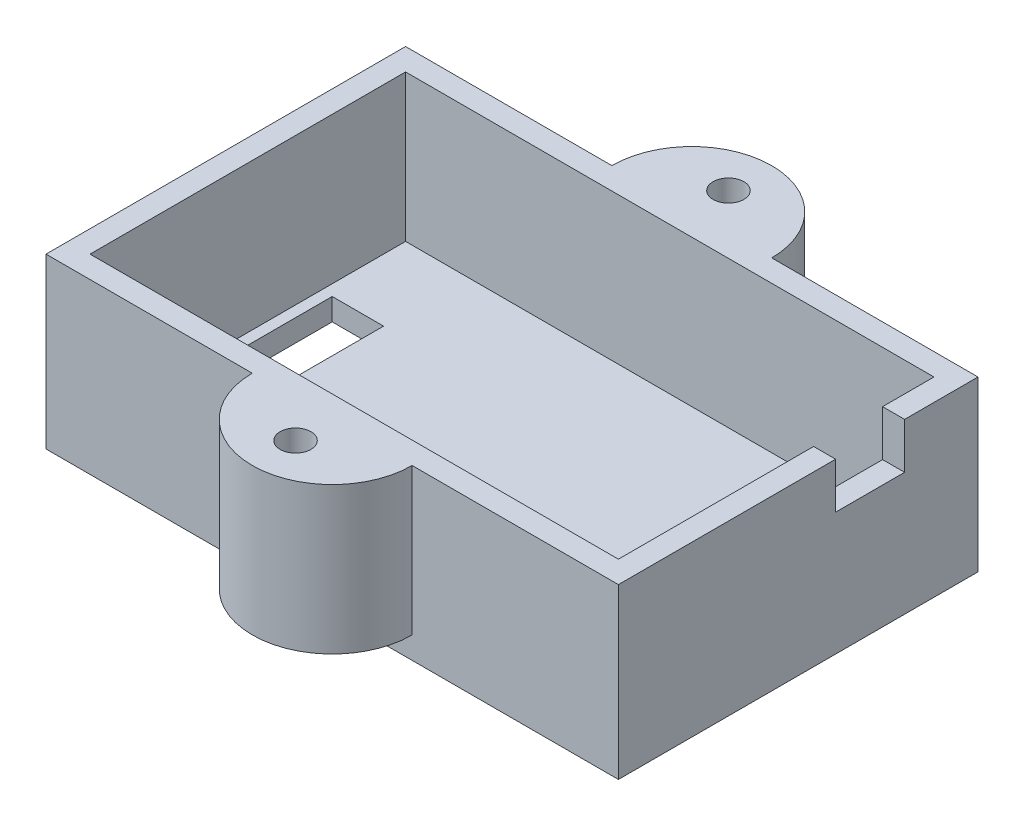
ISO-10303-21;
HEADER;
FILE_DESCRIPTION(('STEP AP214'),'2;1');
FILE_NAME('part.step','',(''),(''),'','','');
FILE_SCHEMA(('AUTOMOTIVE_DESIGN { 1 0 10303 214 1 1 1 1 }'));
ENDSEC;
DATA;
#1=APPLICATION_CONTEXT('core data for automotive mechanical design processes');
#2=APPLICATION_PROTOCOL_DEFINITION('international standard','automotive_design',2000,#1);
#3=PRODUCT_CONTEXT('',#1,'mechanical');
#4=PRODUCT('Part','Part','',(#3));
#5=PRODUCT_RELATED_PRODUCT_CATEGORY('part','',(#4));
#6=PRODUCT_DEFINITION_FORMATION('','',#4);
#7=PRODUCT_DEFINITION_CONTEXT('part definition',#1,'design');
#8=PRODUCT_DEFINITION('design','',#6,#7);
#9=PRODUCT_DEFINITION_SHAPE('','',#8);
#10=(LENGTH_UNIT() NAMED_UNIT(*) SI_UNIT(.MILLI.,.METRE.));
#11=(NAMED_UNIT(*) PLANE_ANGLE_UNIT() SI_UNIT($,.RADIAN.));
#12=(NAMED_UNIT(*) SI_UNIT($,.STERADIAN.) SOLID_ANGLE_UNIT());
#13=UNCERTAINTY_MEASURE_WITH_UNIT(LENGTH_MEASURE(1.E-05),#10,'distance_accuracy_value','');
#14=(GEOMETRIC_REPRESENTATION_CONTEXT(3) GLOBAL_UNCERTAINTY_ASSIGNED_CONTEXT((#13)) GLOBAL_UNIT_ASSIGNED_CONTEXT((#10,
#11,#12)) REPRESENTATION_CONTEXT('',''));
#15=CARTESIAN_POINT('',(0.,0.,0.));
#16=DIRECTION('',(0.,0.,1.));
#17=DIRECTION('',(1.,0.,0.));
#18=AXIS2_PLACEMENT_3D('',#15,#16,#17);
#19=CARTESIAN_POINT('',(0.,0.,-24.5));
#20=DIRECTION('',(0.,1.,0.));
#21=DIRECTION('',(0.,0.,1.));
#22=AXIS2_PLACEMENT_3D('',#19,#20,#21);
#23=PLANE('',#22);
#24=CARTESIAN_POINT('',(0.,0.,-29.5));
#25=DIRECTION('',(0.,1.,0.));
#26=DIRECTION('',(0.,0.,1.));
#27=AXIS2_PLACEMENT_3D('',#24,#25,#26);
#28=CIRCLE('',#27,2.1);
#29=CARTESIAN_POINT('',(0.,0.,-27.4));
#30=VERTEX_POINT('',#29);
#31=EDGE_CURVE('E282',#30,#30,#28,.T.);
#32=ORIENTED_EDGE('',*,*,#31,.T.);
#33=EDGE_LOOP('',(#32));
#34=FACE_BOUND('',#33,.T.);
#35=DIRECTION('',(1.,0.,0.));
#36=VECTOR('',#35,1.);
#37=CARTESIAN_POINT('',(39.,0.,-24.5));
#38=LINE('',#37,#36);
#39=CARTESIAN_POINT('',(-10.89,0.,-24.5));
#40=VERTEX_POINT('',#39);
#41=CARTESIAN_POINT('',(10.89,0.,-24.5));
#42=VERTEX_POINT('',#41);
#43=EDGE_CURVE('E274',#40,#42,#38,.T.);
#44=ORIENTED_EDGE('',*,*,#43,.F.);
#45=CARTESIAN_POINT('',(0.,0.,-24.5));
#46=DIRECTION('',(0.,1.,0.));
#47=DIRECTION('',(0.,0.,1.));
#48=AXIS2_PLACEMENT_3D('',#45,#46,#47);
#49=CIRCLE('',#48,10.89);
#50=EDGE_CURVE('E342',#42,#40,#49,.T.);
#51=ORIENTED_EDGE('',*,*,#50,.F.);
#52=EDGE_LOOP('',(#44,#51));
#53=FACE_BOUND('',#52,.T.);
#54=ADVANCED_FACE('F38',(#34,#53),#23,.F.);
#55=CARTESIAN_POINT('',(0.,0.,29.5));
#56=DIRECTION('',(0.,1.,0.));
#57=DIRECTION('',(0.,0.,1.));
#58=AXIS2_PLACEMENT_3D('',#55,#56,#57);
#59=CIRCLE('',#58,2.1);
#60=CARTESIAN_POINT('',(0.,0.,31.6));
#61=VERTEX_POINT('',#60);
#62=EDGE_CURVE('E270',#61,#61,#59,.T.);
#63=ORIENTED_EDGE('',*,*,#62,.T.);
#64=EDGE_LOOP('',(#63));
#65=FACE_BOUND('',#64,.T.);
#66=DIRECTION('',(-1.,0.,0.));
#67=VECTOR('',#66,1.);
#68=CARTESIAN_POINT('',(39.,0.,24.5));
#69=LINE('',#68,#67);
#70=CARTESIAN_POINT('',(10.89,0.,24.5));
#71=VERTEX_POINT('',#70);
#72=CARTESIAN_POINT('',(-10.89,0.,24.5));
#73=VERTEX_POINT('',#72);
#74=EDGE_CURVE('E271',#71,#73,#69,.T.);
#75=ORIENTED_EDGE('',*,*,#74,.F.);
#76=CARTESIAN_POINT('',(0.,0.,24.5));
#77=DIRECTION('',(0.,1.,0.));
#78=DIRECTION('',(0.,0.,-1.));
#79=AXIS2_PLACEMENT_3D('',#76,#77,#78);
#80=CIRCLE('',#79,10.89);
#81=EDGE_CURVE('E336',#73,#71,#80,.T.);
#82=ORIENTED_EDGE('',*,*,#81,.F.);
#83=EDGE_LOOP('',(#75,#82));
#84=FACE_BOUND('',#83,.T.);
#85=ADVANCED_FACE('F457',(#65,#84),#23,.F.);
#86=CARTESIAN_POINT('',(0.,20.,-24.5));
#87=DIRECTION('',(0.,1.,0.));
#88=DIRECTION('',(0.,0.,1.));
#89=AXIS2_PLACEMENT_3D('',#86,#87,#88);
#90=PLANE('',#89);
#91=DIRECTION('',(1.,0.,0.));
#92=VECTOR('',#91,1.);
#93=CARTESIAN_POINT('',(29.,20.,-5.09999999999999));
#94=LINE('',#93,#92);
#95=CARTESIAN_POINT('',(36.,20.,-5.09999999999999));
#96=VERTEX_POINT('',#95);
#97=CARTESIAN_POINT('',(39.,20.,-5.1));
#98=VERTEX_POINT('',#97);
#99=EDGE_CURVE('E190',#96,#98,#94,.T.);
#100=ORIENTED_EDGE('',*,*,#99,.F.);
#101=DIRECTION('',(0.,0.,-1.));
#102=VECTOR('',#101,1.);
#103=CARTESIAN_POINT('',(36.,20.,-21.5));
#104=LINE('',#103,#102);
#105=CARTESIAN_POINT('',(36.,20.,21.5));
#106=VERTEX_POINT('',#105);
#107=EDGE_CURVE('E294',#106,#96,#104,.T.);
#108=ORIENTED_EDGE('',*,*,#107,.F.);
#109=DIRECTION('',(1.,0.,0.));
#110=VECTOR('',#109,1.);
#111=CARTESIAN_POINT('',(-36.,20.,21.5));
#112=LINE('',#111,#110);
#113=CARTESIAN_POINT('',(-36.,20.,21.5));
#114=VERTEX_POINT('',#113);
#115=EDGE_CURVE('E306',#114,#106,#112,.T.);
#116=ORIENTED_EDGE('',*,*,#115,.F.);
#117=DIRECTION('',(0.,0.,1.));
#118=VECTOR('',#117,1.);
#119=CARTESIAN_POINT('',(-36.,20.,-21.5));
#120=LINE('',#119,#118);
#121=CARTESIAN_POINT('',(-36.,20.,-21.5));
#122=VERTEX_POINT('',#121);
#123=EDGE_CURVE('E302',#122,#114,#120,.T.);
#124=ORIENTED_EDGE('',*,*,#123,.F.);
#125=DIRECTION('',(-1.,0.,0.));
#126=VECTOR('',#125,1.);
#127=CARTESIAN_POINT('',(-36.,20.,-21.5));
#128=LINE('',#127,#126);
#129=CARTESIAN_POINT('',(36.,20.,-21.5));
#130=VERTEX_POINT('',#129);
#131=EDGE_CURVE('E298',#130,#122,#128,.T.);
#132=ORIENTED_EDGE('',*,*,#131,.F.);
#133=CARTESIAN_POINT('',(36.,20.,-14.5));
#134=VERTEX_POINT('',#133);
#135=EDGE_CURVE('E299',#134,#130,#104,.T.);
#136=ORIENTED_EDGE('',*,*,#135,.F.);
#137=DIRECTION('',(1.,0.,0.));
#138=VECTOR('',#137,1.);
#139=CARTESIAN_POINT('',(29.,20.,-14.5));
#140=LINE('',#139,#138);
#141=CARTESIAN_POINT('',(39.,20.,-14.5));
#142=VERTEX_POINT('',#141);
#143=EDGE_CURVE('E208',#134,#142,#140,.T.);
#144=ORIENTED_EDGE('',*,*,#143,.T.);
#145=DIRECTION('',(0.,0.,-1.));
#146=VECTOR('',#145,1.);
#147=CARTESIAN_POINT('',(39.,20.,10.8860619305484));
#148=LINE('',#147,#146);
#149=CARTESIAN_POINT('',(39.,20.,-24.5));
#150=VERTEX_POINT('',#149);
#151=EDGE_CURVE('E354',#142,#150,#148,.T.);
#152=ORIENTED_EDGE('',*,*,#151,.T.);
#153=DIRECTION('',(-1.,0.,0.));
#154=VECTOR('',#153,1.);
#155=CARTESIAN_POINT('',(10.89,20.,-24.5));
#156=LINE('',#155,#154);
#157=CARTESIAN_POINT('',(10.89,20.,-24.5));
#158=VERTEX_POINT('',#157);
#159=EDGE_CURVE('E358',#150,#158,#156,.T.);
#160=ORIENTED_EDGE('',*,*,#159,.T.);
#161=CARTESIAN_POINT('',(0.,20.,-24.5));
#162=DIRECTION('',(0.,1.,0.));
#163=DIRECTION('',(0.,0.,1.));
#164=AXIS2_PLACEMENT_3D('',#161,#162,#163);
#165=CIRCLE('',#164,10.89);
#166=CARTESIAN_POINT('',(-10.89,20.,-24.5));
#167=VERTEX_POINT('',#166);
#168=EDGE_CURVE('E361',#158,#167,#165,.T.);
#169=ORIENTED_EDGE('',*,*,#168,.T.);
#170=DIRECTION('',(-1.,0.,0.));
#171=VECTOR('',#170,1.);
#172=CARTESIAN_POINT('',(-39.,20.,-24.5));
#173=LINE('',#172,#171);
#174=CARTESIAN_POINT('',(-39.,20.,-24.5));
#175=VERTEX_POINT('',#174);
#176=EDGE_CURVE('E337',#167,#175,#173,.T.);
#177=ORIENTED_EDGE('',*,*,#176,.T.);
#178=DIRECTION('',(0.,0.,1.));
#179=VECTOR('',#178,1.);
#180=CARTESIAN_POINT('',(-39.,20.,-24.5));
#181=LINE('',#180,#179);
#182=CARTESIAN_POINT('',(-39.,20.,24.5));
#183=VERTEX_POINT('',#182);
#184=EDGE_CURVE('E341',#175,#183,#181,.T.);
#185=ORIENTED_EDGE('',*,*,#184,.T.);
#186=DIRECTION('',(1.,0.,0.));
#187=VECTOR('',#186,1.);
#188=CARTESIAN_POINT('',(-39.,20.,24.5));
#189=LINE('',#188,#187);
#190=CARTESIAN_POINT('',(-10.89,20.,24.5));
#191=VERTEX_POINT('',#190);
#192=EDGE_CURVE('E345',#183,#191,#189,.T.);
#193=ORIENTED_EDGE('',*,*,#192,.T.);
#194=CARTESIAN_POINT('',(0.,20.,24.5));
#195=DIRECTION('',(0.,1.,0.));
#196=DIRECTION('',(0.,0.,-1.));
#197=AXIS2_PLACEMENT_3D('',#194,#195,#196);
#198=CIRCLE('',#197,10.89);
#199=CARTESIAN_POINT('',(10.89,20.,24.5));
#200=VERTEX_POINT('',#199);
#201=EDGE_CURVE('E348',#191,#200,#198,.T.);
#202=ORIENTED_EDGE('',*,*,#201,.T.);
#203=DIRECTION('',(1.,0.,0.));
#204=VECTOR('',#203,1.);
#205=CARTESIAN_POINT('',(10.89,20.,24.5));
#206=LINE('',#205,#204);
#207=CARTESIAN_POINT('',(39.,20.,24.5));
#208=VERTEX_POINT('',#207);
#209=EDGE_CURVE('E351',#200,#208,#206,.T.);
#210=ORIENTED_EDGE('',*,*,#209,.T.);
#211=EDGE_CURVE('E355',#208,#98,#148,.T.);
#212=ORIENTED_EDGE('',*,*,#211,.T.);
#213=EDGE_LOOP('',(#100,#108,#116,#124,#132,#136,#144,#152,#160,#169,#177,#185,#193,#202,#210,#212));
#214=FACE_BOUND('',#213,.T.);
#215=CARTESIAN_POINT('',(0.,20.,-29.5));
#216=DIRECTION('',(0.,1.,0.));
#217=DIRECTION('',(0.,0.,1.));
#218=AXIS2_PLACEMENT_3D('',#215,#216,#217);
#219=CIRCLE('',#218,2.1);
#220=CARTESIAN_POINT('',(0.,20.,-27.4));
#221=VERTEX_POINT('',#220);
#222=EDGE_CURVE('E286',#221,#221,#219,.T.);
#223=ORIENTED_EDGE('',*,*,#222,.F.);
#224=EDGE_LOOP('',(#223));
#225=FACE_BOUND('',#224,.T.);
#226=CARTESIAN_POINT('',(0.,20.,29.5));
#227=DIRECTION('',(0.,1.,0.));
#228=DIRECTION('',(0.,0.,1.));
#229=AXIS2_PLACEMENT_3D('',#226,#227,#228);
#230=CIRCLE('',#229,2.1);
#231=CARTESIAN_POINT('',(0.,20.,31.6));
#232=VERTEX_POINT('',#231);
#233=EDGE_CURVE('E278',#232,#232,#230,.T.);
#234=ORIENTED_EDGE('',*,*,#233,.F.);
#235=EDGE_LOOP('',(#234));
#236=FACE_BOUND('',#235,.T.);
#237=ADVANCED_FACE('F408',(#214,#225,#236),#90,.T.);
#238=CARTESIAN_POINT('',(-39.,20.,10.8860619305484));
#239=DIRECTION('',(1.,0.,0.));
#240=DIRECTION('',(0.,0.,-1.));
#241=AXIS2_PLACEMENT_3D('',#238,#239,#240);
#242=PLANE('',#241);
#243=DIRECTION('',(0.,-1.,0.));
#244=VECTOR('',#243,1.);
#245=CARTESIAN_POINT('',(-39.,20.,-24.5));
#246=LINE('',#245,#244);
#247=CARTESIAN_POINT('',(-39.,-3.,-24.5));
#248=VERTEX_POINT('',#247);
#249=EDGE_CURVE('E275',#175,#248,#246,.T.);
#250=ORIENTED_EDGE('',*,*,#249,.T.);
#251=DIRECTION('',(0.,0.,-1.));
#252=VECTOR('',#251,1.);
#253=CARTESIAN_POINT('',(-39.,-3.,24.5));
#254=LINE('',#253,#252);
#255=CARTESIAN_POINT('',(-39.,-3.,24.5));
#256=VERTEX_POINT('',#255);
#257=EDGE_CURVE('E262',#256,#248,#254,.T.);
#258=ORIENTED_EDGE('',*,*,#257,.F.);
#259=DIRECTION('',(0.,-1.,0.));
#260=VECTOR('',#259,1.);
#261=CARTESIAN_POINT('',(-39.,20.,24.5));
#262=LINE('',#261,#260);
#263=EDGE_CURVE('E392',#183,#256,#262,.T.);
#264=ORIENTED_EDGE('',*,*,#263,.F.);
#265=ORIENTED_EDGE('',*,*,#184,.F.);
#266=EDGE_LOOP('',(#250,#258,#264,#265));
#267=FACE_BOUND('',#266,.T.);
#268=ADVANCED_FACE('F40',(#267),#242,.F.);
#269=CARTESIAN_POINT('',(0.,20.,24.5));
#270=DIRECTION('',(0.,-1.,0.));
#271=DIRECTION('',(0.,0.,-1.));
#272=AXIS2_PLACEMENT_3D('',#269,#270,#271);
#273=CYLINDRICAL_SURFACE('',#272,10.89);
#274=ORIENTED_EDGE('',*,*,#81,.T.);
#275=DIRECTION('',(0.,-1.,0.));
#276=VECTOR('',#275,1.);
#277=CARTESIAN_POINT('',(10.89,20.,24.5));
#278=LINE('',#277,#276);
#279=EDGE_CURVE('E384',#200,#71,#278,.T.);
#280=ORIENTED_EDGE('',*,*,#279,.F.);
#281=ORIENTED_EDGE('',*,*,#201,.F.);
#282=DIRECTION('',(0.,-1.,0.));
#283=VECTOR('',#282,1.);
#284=CARTESIAN_POINT('',(-10.89,20.,24.5));
#285=LINE('',#284,#283);
#286=EDGE_CURVE('E388',#191,#73,#285,.T.);
#287=ORIENTED_EDGE('',*,*,#286,.T.);
#288=EDGE_LOOP('',(#274,#280,#281,#287));
#289=FACE_BOUND('',#288,.T.);
#290=ADVANCED_FACE('F477',(#289),#273,.T.);
#291=CARTESIAN_POINT('',(10.89,20.,24.5));
#292=DIRECTION('',(0.,0.,-1.));
#293=DIRECTION('',(-1.,0.,0.));
#294=AXIS2_PLACEMENT_3D('',#291,#292,#293);
#295=PLANE('',#294);
#296=ORIENTED_EDGE('',*,*,#279,.T.);
#297=ORIENTED_EDGE('',*,*,#74,.T.);
#298=ORIENTED_EDGE('',*,*,#286,.F.);
#299=ORIENTED_EDGE('',*,*,#192,.F.);
#300=ORIENTED_EDGE('',*,*,#263,.T.);
#301=DIRECTION('',(-1.,0.,0.));
#302=VECTOR('',#301,1.);
#303=CARTESIAN_POINT('',(39.,-3.,24.5));
#304=LINE('',#303,#302);
#305=CARTESIAN_POINT('',(39.,-3.,24.5));
#306=VERTEX_POINT('',#305);
#307=EDGE_CURVE('E258',#306,#256,#304,.T.);
#308=ORIENTED_EDGE('',*,*,#307,.F.);
#309=DIRECTION('',(0.,-1.,0.));
#310=VECTOR('',#309,1.);
#311=CARTESIAN_POINT('',(39.,20.,24.5));
#312=LINE('',#311,#310);
#313=EDGE_CURVE('E381',#208,#306,#312,.T.);
#314=ORIENTED_EDGE('',*,*,#313,.F.);
#315=ORIENTED_EDGE('',*,*,#209,.F.);
#316=EDGE_LOOP('',(#296,#297,#298,#299,#300,#308,#314,#315));
#317=FACE_BOUND('',#316,.T.);
#318=ADVANCED_FACE('F417',(#317),#295,.F.);
#319=CARTESIAN_POINT('',(39.,20.,-24.5));
#320=DIRECTION('',(-1.,0.,0.));
#321=DIRECTION('',(0.,0.,1.));
#322=AXIS2_PLACEMENT_3D('',#319,#320,#321);
#323=PLANE('',#322);
#324=DIRECTION('',(0.,0.,-1.));
#325=VECTOR('',#324,1.);
#326=CARTESIAN_POINT('',(39.,13.75,-5.1));
#327=LINE('',#326,#325);
#328=CARTESIAN_POINT('',(39.,13.75,-5.1));
#329=VERTEX_POINT('',#328);
#330=CARTESIAN_POINT('',(39.,13.75,-14.5));
#331=VERTEX_POINT('',#330);
#332=EDGE_CURVE('E177',#329,#331,#327,.T.);
#333=ORIENTED_EDGE('',*,*,#332,.F.);
#334=DIRECTION('',(0.,-1.,0.));
#335=VECTOR('',#334,1.);
#336=CARTESIAN_POINT('',(39.,20.,-5.1));
#337=LINE('',#336,#335);
#338=EDGE_CURVE('E187',#98,#329,#337,.T.);
#339=ORIENTED_EDGE('',*,*,#338,.F.);
#340=ORIENTED_EDGE('',*,*,#211,.F.);
#341=ORIENTED_EDGE('',*,*,#313,.T.);
#342=DIRECTION('',(0.,0.,1.));
#343=VECTOR('',#342,1.);
#344=CARTESIAN_POINT('',(39.,-3.,24.5));
#345=LINE('',#344,#343);
#346=CARTESIAN_POINT('',(39.,-3.,-24.5));
#347=VERTEX_POINT('',#346);
#348=EDGE_CURVE('E254',#347,#306,#345,.T.);
#349=ORIENTED_EDGE('',*,*,#348,.F.);
#350=DIRECTION('',(0.,-1.,0.));
#351=VECTOR('',#350,1.);
#352=CARTESIAN_POINT('',(39.,20.,-24.5));
#353=LINE('',#352,#351);
#354=EDGE_CURVE('E378',#150,#347,#353,.T.);
#355=ORIENTED_EDGE('',*,*,#354,.F.);
#356=ORIENTED_EDGE('',*,*,#151,.F.);
#357=DIRECTION('',(0.,1.,0.));
#358=VECTOR('',#357,1.);
#359=CARTESIAN_POINT('',(39.,20.,-14.5));
#360=LINE('',#359,#358);
#361=EDGE_CURVE('E184',#331,#142,#360,.T.);
#362=ORIENTED_EDGE('',*,*,#361,.F.);
#363=EDGE_LOOP('',(#333,#339,#340,#341,#349,#355,#356,#362));
#364=FACE_BOUND('',#363,.T.);
#365=ADVANCED_FACE('F196',(#364),#323,.F.);
#366=CARTESIAN_POINT('',(10.89,20.,-24.5));
#367=DIRECTION('',(0.,0.,1.));
#368=DIRECTION('',(1.,0.,0.));
#369=AXIS2_PLACEMENT_3D('',#366,#367,#368);
#370=PLANE('',#369);
#371=ORIENTED_EDGE('',*,*,#354,.T.);
#372=DIRECTION('',(1.,0.,0.));
#373=VECTOR('',#372,1.);
#374=CARTESIAN_POINT('',(39.,-3.,-24.5));
#375=LINE('',#374,#373);
#376=EDGE_CURVE('E266',#248,#347,#375,.T.);
#377=ORIENTED_EDGE('',*,*,#376,.F.);
#378=ORIENTED_EDGE('',*,*,#249,.F.);
#379=ORIENTED_EDGE('',*,*,#176,.F.);
#380=DIRECTION('',(0.,-1.,0.));
#381=VECTOR('',#380,1.);
#382=CARTESIAN_POINT('',(-10.89,20.,-24.5));
#383=LINE('',#382,#381);
#384=EDGE_CURVE('E364',#167,#40,#383,.T.);
#385=ORIENTED_EDGE('',*,*,#384,.T.);
#386=ORIENTED_EDGE('',*,*,#43,.T.);
#387=DIRECTION('',(0.,-1.,0.));
#388=VECTOR('',#387,1.);
#389=CARTESIAN_POINT('',(10.89,20.,-24.5));
#390=LINE('',#389,#388);
#391=EDGE_CURVE('E374',#158,#42,#390,.T.);
#392=ORIENTED_EDGE('',*,*,#391,.F.);
#393=ORIENTED_EDGE('',*,*,#159,.F.);
#394=EDGE_LOOP('',(#371,#377,#378,#379,#385,#386,#392,#393));
#395=FACE_BOUND('',#394,.T.);
#396=ADVANCED_FACE('F426',(#395),#370,.F.);
#397=CARTESIAN_POINT('',(0.,20.,-24.5));
#398=DIRECTION('',(0.,-1.,0.));
#399=DIRECTION('',(0.,0.,-1.));
#400=AXIS2_PLACEMENT_3D('',#397,#398,#399);
#401=CYLINDRICAL_SURFACE('',#400,10.89);
#402=ORIENTED_EDGE('',*,*,#50,.T.);
#403=ORIENTED_EDGE('',*,*,#384,.F.);
#404=ORIENTED_EDGE('',*,*,#168,.F.);
#405=ORIENTED_EDGE('',*,*,#391,.T.);
#406=EDGE_LOOP('',(#402,#403,#404,#405));
#407=FACE_BOUND('',#406,.T.);
#408=ADVANCED_FACE('F468',(#407),#401,.T.);
#409=CARTESIAN_POINT('',(36.,20.,-21.5));
#410=DIRECTION('',(-1.,0.,0.));
#411=DIRECTION('',(0.,0.,1.));
#412=AXIS2_PLACEMENT_3D('',#409,#410,#411);
#413=PLANE('',#412);
#414=DIRECTION('',(0.,1.,0.));
#415=VECTOR('',#414,1.);
#416=CARTESIAN_POINT('',(36.,20.,-5.09999999999999));
#417=LINE('',#416,#415);
#418=CARTESIAN_POINT('',(36.,13.75,-5.09999999999999));
#419=VERTEX_POINT('',#418);
#420=EDGE_CURVE('E11',#419,#96,#417,.T.);
#421=ORIENTED_EDGE('',*,*,#420,.F.);
#422=DIRECTION('',(0.,0.,1.));
#423=VECTOR('',#422,1.);
#424=CARTESIAN_POINT('',(36.,13.75,-21.5));
#425=LINE('',#424,#423);
#426=CARTESIAN_POINT('',(36.,13.75,-14.5));
#427=VERTEX_POINT('',#426);
#428=EDGE_CURVE('E180',#427,#419,#425,.T.);
#429=ORIENTED_EDGE('',*,*,#428,.F.);
#430=DIRECTION('',(0.,-1.,0.));
#431=VECTOR('',#430,1.);
#432=CARTESIAN_POINT('',(36.,20.,-14.5));
#433=LINE('',#432,#431);
#434=EDGE_CURVE('E47',#134,#427,#433,.T.);
#435=ORIENTED_EDGE('',*,*,#434,.F.);
#436=ORIENTED_EDGE('',*,*,#135,.T.);
#437=DIRECTION('',(0.,-1.,0.));
#438=VECTOR('',#437,1.);
#439=CARTESIAN_POINT('',(36.,20.,-21.5));
#440=LINE('',#439,#438);
#441=CARTESIAN_POINT('',(36.,0.,-21.5));
#442=VERTEX_POINT('',#441);
#443=EDGE_CURVE('E332',#130,#442,#440,.T.);
#444=ORIENTED_EDGE('',*,*,#443,.T.);
#445=DIRECTION('',(0.,0.,-1.));
#446=VECTOR('',#445,1.);
#447=CARTESIAN_POINT('',(36.,0.,-21.5));
#448=LINE('',#447,#446);
#449=CARTESIAN_POINT('',(36.,0.,21.5));
#450=VERTEX_POINT('',#449);
#451=EDGE_CURVE('E290',#450,#442,#448,.T.);
#452=ORIENTED_EDGE('',*,*,#451,.F.);
#453=DIRECTION('',(0.,-1.,0.));
#454=VECTOR('',#453,1.);
#455=CARTESIAN_POINT('',(36.,20.,21.5));
#456=LINE('',#455,#454);
#457=EDGE_CURVE('E309',#106,#450,#456,.T.);
#458=ORIENTED_EDGE('',*,*,#457,.F.);
#459=ORIENTED_EDGE('',*,*,#107,.T.);
#460=EDGE_LOOP('',(#421,#429,#435,#436,#444,#452,#458,#459));
#461=FACE_BOUND('',#460,.T.);
#462=ADVANCED_FACE('F404',(#461),#413,.T.);
#463=CARTESIAN_POINT('',(-36.,20.,-21.5));
#464=DIRECTION('',(0.,0.,1.));
#465=DIRECTION('',(1.,0.,0.));
#466=AXIS2_PLACEMENT_3D('',#463,#464,#465);
#467=PLANE('',#466);
#468=DIRECTION('',(-1.,0.,0.));
#469=VECTOR('',#468,1.);
#470=CARTESIAN_POINT('',(-36.,0.,-21.5));
#471=LINE('',#470,#469);
#472=CARTESIAN_POINT('',(-36.,0.,-21.5));
#473=VERTEX_POINT('',#472);
#474=EDGE_CURVE('E312',#442,#473,#471,.T.);
#475=ORIENTED_EDGE('',*,*,#474,.F.);
#476=ORIENTED_EDGE('',*,*,#443,.F.);
#477=ORIENTED_EDGE('',*,*,#131,.T.);
#478=DIRECTION('',(0.,-1.,0.));
#479=VECTOR('',#478,1.);
#480=CARTESIAN_POINT('',(-36.,20.,-21.5));
#481=LINE('',#480,#479);
#482=EDGE_CURVE('E329',#122,#473,#481,.T.);
#483=ORIENTED_EDGE('',*,*,#482,.T.);
#484=EDGE_LOOP('',(#475,#476,#477,#483));
#485=FACE_BOUND('',#484,.T.);
#486=ADVANCED_FACE('F437',(#485),#467,.T.);
#487=CARTESIAN_POINT('',(-36.,20.,-21.5));
#488=DIRECTION('',(1.,0.,0.));
#489=DIRECTION('',(0.,0.,-1.));
#490=AXIS2_PLACEMENT_3D('',#487,#488,#489);
#491=PLANE('',#490);
#492=DIRECTION('',(0.,0.,1.));
#493=VECTOR('',#492,1.);
#494=CARTESIAN_POINT('',(-36.,0.,-21.5));
#495=LINE('',#494,#493);
#496=CARTESIAN_POINT('',(-36.,0.,21.5));
#497=VERTEX_POINT('',#496);
#498=EDGE_CURVE('E316',#473,#497,#495,.T.);
#499=ORIENTED_EDGE('',*,*,#498,.F.);
#500=ORIENTED_EDGE('',*,*,#482,.F.);
#501=ORIENTED_EDGE('',*,*,#123,.T.);
#502=DIRECTION('',(0.,-1.,0.));
#503=VECTOR('',#502,1.);
#504=CARTESIAN_POINT('',(-36.,20.,21.5));
#505=LINE('',#504,#503);
#506=EDGE_CURVE('E326',#114,#497,#505,.T.);
#507=ORIENTED_EDGE('',*,*,#506,.T.);
#508=EDGE_LOOP('',(#499,#500,#501,#507));
#509=FACE_BOUND('',#508,.T.);
#510=ADVANCED_FACE('F446',(#509),#491,.T.);
#511=CARTESIAN_POINT('',(-36.,20.,21.5));
#512=DIRECTION('',(0.,0.,-1.));
#513=DIRECTION('',(-1.,0.,0.));
#514=AXIS2_PLACEMENT_3D('',#511,#512,#513);
#515=PLANE('',#514);
#516=DIRECTION('',(1.,0.,0.));
#517=VECTOR('',#516,1.);
#518=CARTESIAN_POINT('',(-36.,0.,21.5));
#519=LINE('',#518,#517);
#520=EDGE_CURVE('E320',#497,#450,#519,.T.);
#521=ORIENTED_EDGE('',*,*,#520,.F.);
#522=ORIENTED_EDGE('',*,*,#506,.F.);
#523=ORIENTED_EDGE('',*,*,#115,.T.);
#524=ORIENTED_EDGE('',*,*,#457,.T.);
#525=EDGE_LOOP('',(#521,#522,#523,#524));
#526=FACE_BOUND('',#525,.T.);
#527=ADVANCED_FACE('F444',(#526),#515,.T.);
#528=CARTESIAN_POINT('',(0.,20.,-29.5));
#529=DIRECTION('',(0.,-1.,0.));
#530=DIRECTION('',(0.,0.,-1.));
#531=AXIS2_PLACEMENT_3D('',#528,#529,#530);
#532=CYLINDRICAL_SURFACE('',#531,2.1);
#533=ORIENTED_EDGE('',*,*,#222,.T.);
#534=EDGE_LOOP('',(#533));
#535=FACE_BOUND('',#534,.T.);
#536=ORIENTED_EDGE('',*,*,#31,.F.);
#537=EDGE_LOOP('',(#536));
#538=FACE_BOUND('',#537,.T.);
#539=ADVANCED_FACE('F453',(#535,#538),#532,.F.);
#540=CARTESIAN_POINT('',(0.,20.,29.5));
#541=DIRECTION('',(0.,-1.,0.));
#542=DIRECTION('',(0.,0.,-1.));
#543=AXIS2_PLACEMENT_3D('',#540,#541,#542);
#544=CYLINDRICAL_SURFACE('',#543,2.1);
#545=ORIENTED_EDGE('',*,*,#233,.T.);
#546=EDGE_LOOP('',(#545));
#547=FACE_BOUND('',#546,.T.);
#548=ORIENTED_EDGE('',*,*,#62,.F.);
#549=EDGE_LOOP('',(#548));
#550=FACE_BOUND('',#549,.T.);
#551=ADVANCED_FACE('F511',(#547,#550),#544,.F.);
#552=CARTESIAN_POINT('',(0.,-3.,0.));
#553=DIRECTION('',(0.,1.,0.));
#554=DIRECTION('',(0.,0.,1.));
#555=AXIS2_PLACEMENT_3D('',#552,#553,#554);
#556=PLANE('',#555);
#557=DIRECTION('',(-1.,0.,0.));
#558=VECTOR('',#557,1.);
#559=CARTESIAN_POINT('',(0.,-3.,-9.99999999999999));
#560=LINE('',#559,#558);
#561=CARTESIAN_POINT('',(-27.5,-3.,-9.99999999999999));
#562=VERTEX_POINT('',#561);
#563=CARTESIAN_POINT('',(-34.5,-3.,-9.99999999999999));
#564=VERTEX_POINT('',#563);
#565=EDGE_CURVE('E246',#562,#564,#560,.T.);
#566=ORIENTED_EDGE('',*,*,#565,.T.);
#567=DIRECTION('',(0.,0.,1.));
#568=VECTOR('',#567,1.);
#569=CARTESIAN_POINT('',(-34.5,-3.,0.));
#570=LINE('',#569,#568);
#571=CARTESIAN_POINT('',(-34.5,-3.,10.));
#572=VERTEX_POINT('',#571);
#573=EDGE_CURVE('E250',#564,#572,#570,.T.);
#574=ORIENTED_EDGE('',*,*,#573,.T.);
#575=DIRECTION('',(1.,0.,0.));
#576=VECTOR('',#575,1.);
#577=CARTESIAN_POINT('',(0.,-3.,10.));
#578=LINE('',#577,#576);
#579=CARTESIAN_POINT('',(-27.5,-3.,10.));
#580=VERTEX_POINT('',#579);
#581=EDGE_CURVE('E231',#572,#580,#578,.T.);
#582=ORIENTED_EDGE('',*,*,#581,.T.);
#583=DIRECTION('',(0.,0.,-1.));
#584=VECTOR('',#583,1.);
#585=CARTESIAN_POINT('',(-27.5,-3.,0.));
#586=LINE('',#585,#584);
#587=EDGE_CURVE('E242',#580,#562,#586,.T.);
#588=ORIENTED_EDGE('',*,*,#587,.T.);
#589=EDGE_LOOP('',(#566,#574,#582,#588));
#590=FACE_BOUND('',#589,.T.);
#591=ORIENTED_EDGE('',*,*,#348,.T.);
#592=ORIENTED_EDGE('',*,*,#307,.T.);
#593=ORIENTED_EDGE('',*,*,#257,.T.);
#594=ORIENTED_EDGE('',*,*,#376,.T.);
#595=EDGE_LOOP('',(#591,#592,#593,#594));
#596=FACE_BOUND('',#595,.T.);
#597=ADVANCED_FACE('F422',(#590,#596),#556,.F.);
#598=CARTESIAN_POINT('',(0.,0.,0.));
#599=DIRECTION('',(0.,1.,0.));
#600=DIRECTION('',(0.,0.,1.));
#601=AXIS2_PLACEMENT_3D('',#598,#599,#600);
#602=PLANE('',#601);
#603=DIRECTION('',(0.,0.,1.));
#604=VECTOR('',#603,1.);
#605=CARTESIAN_POINT('',(-34.5,0.,10.));
#606=LINE('',#605,#604);
#607=CARTESIAN_POINT('',(-34.5,0.,-9.99999999999999));
#608=VERTEX_POINT('',#607);
#609=CARTESIAN_POINT('',(-34.5,0.,10.));
#610=VERTEX_POINT('',#609);
#611=EDGE_CURVE('E207',#608,#610,#606,.T.);
#612=ORIENTED_EDGE('',*,*,#611,.F.);
#613=DIRECTION('',(-1.,0.,0.));
#614=VECTOR('',#613,1.);
#615=CARTESIAN_POINT('',(-27.5,0.,-9.99999999999999));
#616=LINE('',#615,#614);
#617=CARTESIAN_POINT('',(-27.5,0.,-9.99999999999999));
#618=VERTEX_POINT('',#617);
#619=EDGE_CURVE('E223',#618,#608,#616,.T.);
#620=ORIENTED_EDGE('',*,*,#619,.F.);
#621=DIRECTION('',(0.,0.,-1.));
#622=VECTOR('',#621,1.);
#623=CARTESIAN_POINT('',(-27.5,0.,10.));
#624=LINE('',#623,#622);
#625=CARTESIAN_POINT('',(-27.5,0.,10.));
#626=VERTEX_POINT('',#625);
#627=EDGE_CURVE('E219',#626,#618,#624,.T.);
#628=ORIENTED_EDGE('',*,*,#627,.F.);
#629=DIRECTION('',(1.,0.,0.));
#630=VECTOR('',#629,1.);
#631=CARTESIAN_POINT('',(-27.5,0.,10.));
#632=LINE('',#631,#630);
#633=EDGE_CURVE('E216',#610,#626,#632,.T.);
#634=ORIENTED_EDGE('',*,*,#633,.F.);
#635=EDGE_LOOP('',(#612,#620,#628,#634));
#636=FACE_BOUND('',#635,.T.);
#637=ORIENTED_EDGE('',*,*,#520,.T.);
#638=ORIENTED_EDGE('',*,*,#451,.T.);
#639=ORIENTED_EDGE('',*,*,#474,.T.);
#640=ORIENTED_EDGE('',*,*,#498,.T.);
#641=EDGE_LOOP('',(#637,#638,#639,#640));
#642=FACE_BOUND('',#641,.T.);
#643=ADVANCED_FACE('F441',(#636,#642),#602,.T.);
#644=CARTESIAN_POINT('',(-34.5,-10.,10.));
#645=DIRECTION('',(-1.,0.,0.));
#646=DIRECTION('',(0.,0.,1.));
#647=AXIS2_PLACEMENT_3D('',#644,#645,#646);
#648=PLANE('',#647);
#649=DIRECTION('',(0.,1.,0.));
#650=VECTOR('',#649,1.);
#651=CARTESIAN_POINT('',(-34.5,-10.,-9.99999999999999));
#652=LINE('',#651,#650);
#653=EDGE_CURVE('E228',#564,#608,#652,.T.);
#654=ORIENTED_EDGE('',*,*,#653,.T.);
#655=ORIENTED_EDGE('',*,*,#611,.T.);
#656=DIRECTION('',(0.,1.,0.));
#657=VECTOR('',#656,1.);
#658=CARTESIAN_POINT('',(-34.5,-10.,10.));
#659=LINE('',#658,#657);
#660=EDGE_CURVE('E227',#572,#610,#659,.T.);
#661=ORIENTED_EDGE('',*,*,#660,.F.);
#662=ORIENTED_EDGE('',*,*,#573,.F.);
#663=EDGE_LOOP('',(#654,#655,#661,#662));
#664=FACE_BOUND('',#663,.T.);
#665=ADVANCED_FACE('F613',(#664),#648,.F.);
#666=CARTESIAN_POINT('',(-27.5,-10.,-9.99999999999999));
#667=DIRECTION('',(0.,0.,-1.));
#668=DIRECTION('',(-1.,0.,0.));
#669=AXIS2_PLACEMENT_3D('',#666,#667,#668);
#670=PLANE('',#669);
#671=DIRECTION('',(0.,1.,0.));
#672=VECTOR('',#671,1.);
#673=CARTESIAN_POINT('',(-27.5,-10.,-9.99999999999999));
#674=LINE('',#673,#672);
#675=EDGE_CURVE('E232',#562,#618,#674,.T.);
#676=ORIENTED_EDGE('',*,*,#675,.T.);
#677=ORIENTED_EDGE('',*,*,#619,.T.);
#678=ORIENTED_EDGE('',*,*,#653,.F.);
#679=ORIENTED_EDGE('',*,*,#565,.F.);
#680=EDGE_LOOP('',(#676,#677,#678,#679));
#681=FACE_BOUND('',#680,.T.);
#682=ADVANCED_FACE('F623',(#681),#670,.F.);
#683=CARTESIAN_POINT('',(-27.5,-10.,10.));
#684=DIRECTION('',(1.,0.,0.));
#685=DIRECTION('',(0.,0.,-1.));
#686=AXIS2_PLACEMENT_3D('',#683,#684,#685);
#687=PLANE('',#686);
#688=DIRECTION('',(0.,1.,0.));
#689=VECTOR('',#688,1.);
#690=CARTESIAN_POINT('',(-27.5,-10.,10.));
#691=LINE('',#690,#689);
#692=EDGE_CURVE('E62',#580,#626,#691,.T.);
#693=ORIENTED_EDGE('',*,*,#692,.T.);
#694=ORIENTED_EDGE('',*,*,#627,.T.);
#695=ORIENTED_EDGE('',*,*,#675,.F.);
#696=ORIENTED_EDGE('',*,*,#587,.F.);
#697=EDGE_LOOP('',(#693,#694,#695,#696));
#698=FACE_BOUND('',#697,.T.);
#699=ADVANCED_FACE('F633',(#698),#687,.F.);
#700=CARTESIAN_POINT('',(-27.5,-10.,10.));
#701=DIRECTION('',(0.,0.,1.));
#702=DIRECTION('',(1.,0.,0.));
#703=AXIS2_PLACEMENT_3D('',#700,#701,#702);
#704=PLANE('',#703);
#705=ORIENTED_EDGE('',*,*,#660,.T.);
#706=ORIENTED_EDGE('',*,*,#633,.T.);
#707=ORIENTED_EDGE('',*,*,#692,.F.);
#708=ORIENTED_EDGE('',*,*,#581,.F.);
#709=EDGE_LOOP('',(#705,#706,#707,#708));
#710=FACE_BOUND('',#709,.T.);
#711=ADVANCED_FACE('F643',(#710),#704,.F.);
#712=CARTESIAN_POINT('',(29.,20.,-5.09999999999999));
#713=DIRECTION('',(0.,0.,1.));
#714=DIRECTION('',(1.,0.,0.));
#715=AXIS2_PLACEMENT_3D('',#712,#713,#714);
#716=PLANE('',#715);
#717=ORIENTED_EDGE('',*,*,#420,.T.);
#718=ORIENTED_EDGE('',*,*,#99,.T.);
#719=ORIENTED_EDGE('',*,*,#338,.T.);
#720=DIRECTION('',(1.,0.,0.));
#721=VECTOR('',#720,1.);
#722=CARTESIAN_POINT('',(29.,13.75,-5.09999999999999));
#723=LINE('',#722,#721);
#724=EDGE_CURVE('E173',#419,#329,#723,.T.);
#725=ORIENTED_EDGE('',*,*,#724,.F.);
#726=EDGE_LOOP('',(#717,#718,#719,#725));
#727=FACE_BOUND('',#726,.T.);
#728=ADVANCED_FACE('F188',(#727),#716,.F.);
#729=CARTESIAN_POINT('',(29.,20.,-14.5));
#730=DIRECTION('',(0.,0.,-1.));
#731=DIRECTION('',(-1.,0.,0.));
#732=AXIS2_PLACEMENT_3D('',#729,#730,#731);
#733=PLANE('',#732);
#734=ORIENTED_EDGE('',*,*,#434,.T.);
#735=DIRECTION('',(1.,0.,0.));
#736=VECTOR('',#735,1.);
#737=CARTESIAN_POINT('',(29.,13.75,-14.5));
#738=LINE('',#737,#736);
#739=EDGE_CURVE('E54',#427,#331,#738,.T.);
#740=ORIENTED_EDGE('',*,*,#739,.T.);
#741=ORIENTED_EDGE('',*,*,#361,.T.);
#742=ORIENTED_EDGE('',*,*,#143,.F.);
#743=EDGE_LOOP('',(#734,#740,#741,#742));
#744=FACE_BOUND('',#743,.T.);
#745=ADVANCED_FACE('F401',(#744),#733,.F.);
#746=CARTESIAN_POINT('',(29.,13.75,-5.09999999999999));
#747=DIRECTION('',(0.,-1.,0.));
#748=DIRECTION('',(0.,0.,-1.));
#749=AXIS2_PLACEMENT_3D('',#746,#747,#748);
#750=PLANE('',#749);
#751=ORIENTED_EDGE('',*,*,#428,.T.);
#752=ORIENTED_EDGE('',*,*,#724,.T.);
#753=ORIENTED_EDGE('',*,*,#332,.T.);
#754=ORIENTED_EDGE('',*,*,#739,.F.);
#755=EDGE_LOOP('',(#751,#752,#753,#754));
#756=FACE_BOUND('',#755,.T.);
#757=ADVANCED_FACE('F175',(#756),#750,.F.);
#758=CLOSED_SHELL('',(#54,#85,#237,#268,#290,#318,#365,#396,#408,#462,#486,#510,#527,#539,#551,
#597,#643,#665,#682,#699,#711,#728,#745,#757));
#759=MANIFOLD_SOLID_BREP('B2',#758);
#760=ADVANCED_BREP_SHAPE_REPRESENTATION('',(#18,#759),#14);
#761=SHAPE_DEFINITION_REPRESENTATION(#9,#760);
ENDSEC;
END-ISO-10303-21;
